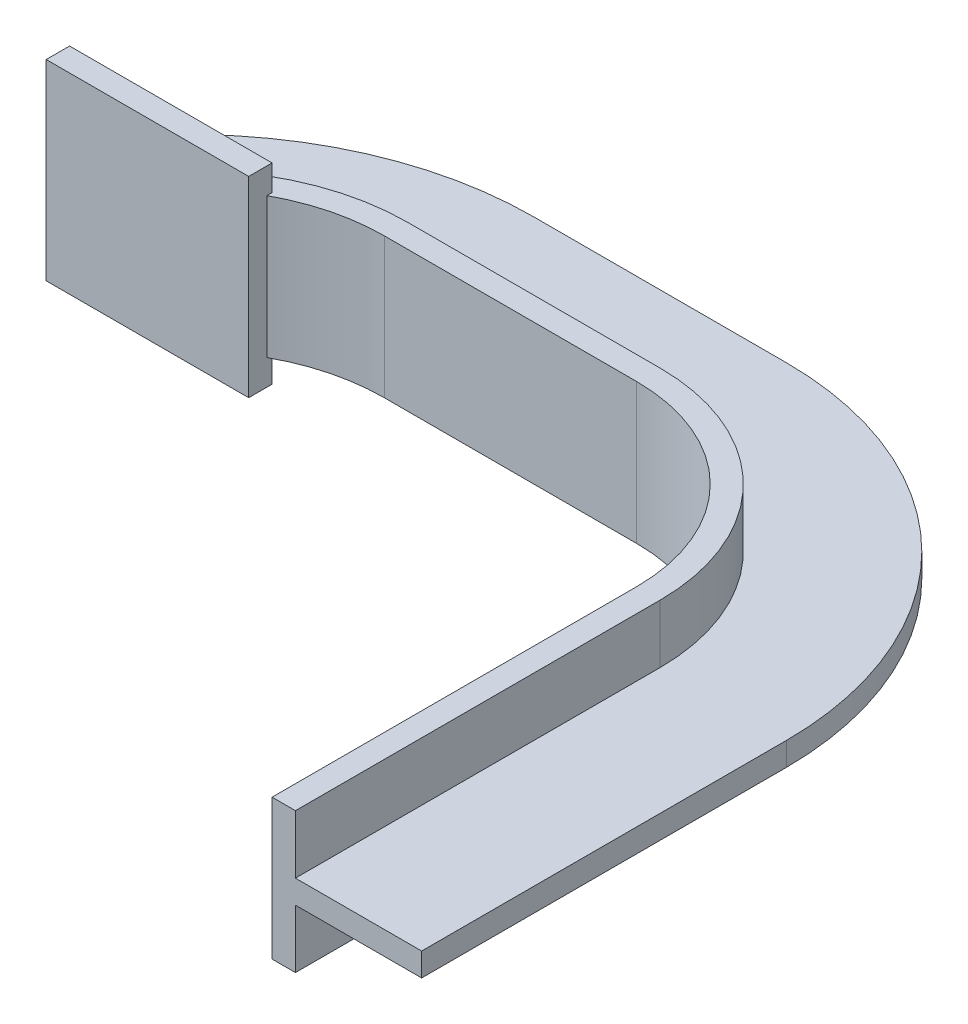
ISO-10303-21;
HEADER;
FILE_DESCRIPTION(('STEP AP214'),'2;1');
FILE_NAME('part.step','',(''),(''),'','','');
FILE_SCHEMA(('AUTOMOTIVE_DESIGN { 1 0 10303 214 1 1 1 1 }'));
ENDSEC;
DATA;
#1=APPLICATION_CONTEXT('core data for automotive mechanical design processes');
#2=APPLICATION_PROTOCOL_DEFINITION('international standard','automotive_design',2000,#1);
#3=PRODUCT_CONTEXT('',#1,'mechanical');
#4=PRODUCT('Part','Part','',(#3));
#5=PRODUCT_RELATED_PRODUCT_CATEGORY('part','',(#4));
#6=PRODUCT_DEFINITION_FORMATION('','',#4);
#7=PRODUCT_DEFINITION_CONTEXT('part definition',#1,'design');
#8=PRODUCT_DEFINITION('design','',#6,#7);
#9=PRODUCT_DEFINITION_SHAPE('','',#8);
#10=(LENGTH_UNIT() NAMED_UNIT(*) SI_UNIT(.MILLI.,.METRE.));
#11=(NAMED_UNIT(*) PLANE_ANGLE_UNIT() SI_UNIT($,.RADIAN.));
#12=(NAMED_UNIT(*) SI_UNIT($,.STERADIAN.) SOLID_ANGLE_UNIT());
#13=UNCERTAINTY_MEASURE_WITH_UNIT(LENGTH_MEASURE(1.E-05),#10,'distance_accuracy_value','');
#14=(GEOMETRIC_REPRESENTATION_CONTEXT(3) GLOBAL_UNCERTAINTY_ASSIGNED_CONTEXT((#13)) GLOBAL_UNIT_ASSIGNED_CONTEXT((#10,
#11,#12)) REPRESENTATION_CONTEXT('',''));
#15=CARTESIAN_POINT('',(0.,0.,0.));
#16=DIRECTION('',(0.,0.,1.));
#17=DIRECTION('',(1.,0.,0.));
#18=AXIS2_PLACEMENT_3D('',#15,#16,#17);
#19=CARTESIAN_POINT('',(-58.42,0.,-47.1870689655173));
#20=DIRECTION('',(0.,1.,0.));
#21=DIRECTION('',(0.,0.,1.));
#22=AXIS2_PLACEMENT_3D('',#19,#20,#21);
#23=CYLINDRICAL_SURFACE('',#22,26.4729310344827);
#24=CARTESIAN_POINT('',(-58.42,9.525,-47.1870689655173));
#25=DIRECTION('',(0.,1.,0.));
#26=DIRECTION('',(0.,0.,1.));
#27=AXIS2_PLACEMENT_3D('',#24,#25,#26);
#28=CIRCLE('',#27,26.4729310344827);
#29=CARTESIAN_POINT('',(-58.42,9.525,-73.66));
#30=VERTEX_POINT('',#29);
#31=CARTESIAN_POINT('',(-71.12,9.52500000000004,-70.4147696170341));
#32=VERTEX_POINT('',#31);
#33=EDGE_CURVE('E395',#30,#32,#28,.T.);
#34=ORIENTED_EDGE('',*,*,#33,.T.);
#35=DIRECTION('',(0.,1.,0.));
#36=VECTOR('',#35,1.);
#37=CARTESIAN_POINT('',(-71.1200000000001,0.,-70.4147696170341));
#38=LINE('',#37,#36);
#39=CARTESIAN_POINT('',(-71.12,-9.525,-70.4147696170342));
#40=VERTEX_POINT('',#39);
#41=EDGE_CURVE('E253',#32,#40,#38,.F.);
#42=ORIENTED_EDGE('',*,*,#41,.T.);
#43=CARTESIAN_POINT('',(-58.42,-9.525,-47.1870689655173));
#44=DIRECTION('',(0.,1.,0.));
#45=DIRECTION('',(0.,0.,1.));
#46=AXIS2_PLACEMENT_3D('',#43,#44,#45);
#47=CIRCLE('',#46,26.4729310344827);
#48=CARTESIAN_POINT('',(-58.42,-9.525,-73.66));
#49=VERTEX_POINT('',#48);
#50=EDGE_CURVE('E62',#49,#40,#47,.T.);
#51=ORIENTED_EDGE('',*,*,#50,.F.);
#52=DIRECTION('',(0.,-1.,0.));
#53=VECTOR('',#52,1.);
#54=CARTESIAN_POINT('',(-58.42,-9.525,-73.66));
#55=LINE('',#54,#53);
#56=EDGE_CURVE('E354',#30,#49,#55,.T.);
#57=ORIENTED_EDGE('',*,*,#56,.F.);
#58=EDGE_LOOP('',(#34,#42,#51,#57));
#59=FACE_BOUND('',#58,.T.);
#60=ADVANCED_FACE('F40',(#59),#23,.F.);
#61=CARTESIAN_POINT('',(-58.42,0.,-47.1870689655173));
#62=DIRECTION('',(0.,1.,0.));
#63=DIRECTION('',(0.,0.,1.));
#64=AXIS2_PLACEMENT_3D('',#61,#62,#63);
#65=CYLINDRICAL_SURFACE('',#64,29.6479310344827);
#66=CARTESIAN_POINT('',(-58.42,1.5875,-47.1870689655173));
#67=DIRECTION('',(0.,1.,0.));
#68=DIRECTION('',(0.,0.,1.));
#69=AXIS2_PLACEMENT_3D('',#66,#67,#68);
#70=CIRCLE('',#69,29.6479310344827);
#71=CARTESIAN_POINT('',(-58.42,1.5875,-76.835));
#72=VERTEX_POINT('',#71);
#73=CARTESIAN_POINT('',(-75.9189893057896,1.58749999999999,-71.12));
#74=VERTEX_POINT('',#73);
#75=EDGE_CURVE('E389',#72,#74,#70,.T.);
#76=ORIENTED_EDGE('',*,*,#75,.T.);
#77=DIRECTION('',(0.,1.,0.));
#78=VECTOR('',#77,1.);
#79=CARTESIAN_POINT('',(-75.9189893057896,0.,-71.12));
#80=LINE('',#79,#78);
#81=CARTESIAN_POINT('',(-75.9189893057896,9.525,-71.12));
#82=VERTEX_POINT('',#81);
#83=EDGE_CURVE('E248',#74,#82,#80,.T.);
#84=ORIENTED_EDGE('',*,*,#83,.T.);
#85=CARTESIAN_POINT('',(-58.42,9.525,-47.1870689655173));
#86=DIRECTION('',(0.,1.,0.));
#87=DIRECTION('',(0.,0.,1.));
#88=AXIS2_PLACEMENT_3D('',#85,#86,#87);
#89=CIRCLE('',#88,29.6479310344827);
#90=CARTESIAN_POINT('',(-58.42,9.525,-76.835));
#91=VERTEX_POINT('',#90);
#92=EDGE_CURVE('E392',#91,#82,#89,.T.);
#93=ORIENTED_EDGE('',*,*,#92,.F.);
#94=DIRECTION('',(0.,1.,0.));
#95=VECTOR('',#94,1.);
#96=CARTESIAN_POINT('',(-58.42,9.525,-76.835));
#97=LINE('',#96,#95);
#98=EDGE_CURVE('E351',#72,#91,#97,.T.);
#99=ORIENTED_EDGE('',*,*,#98,.F.);
#100=EDGE_LOOP('',(#76,#84,#93,#99));
#101=FACE_BOUND('',#100,.T.);
#102=ADVANCED_FACE('F495',(#101),#65,.T.);
#103=CARTESIAN_POINT('',(-58.42,0.,-47.1870689655173));
#104=DIRECTION('',(0.,1.,0.));
#105=DIRECTION('',(0.,0.,1.));
#106=AXIS2_PLACEMENT_3D('',#103,#104,#105);
#107=CYLINDRICAL_SURFACE('',#106,46.7929310344827);
#108=CARTESIAN_POINT('',(-58.42,-1.5875,-47.1870689655173));
#109=DIRECTION('',(0.,1.,0.));
#110=DIRECTION('',(0.,0.,1.));
#111=AXIS2_PLACEMENT_3D('',#108,#109,#110);
#112=CIRCLE('',#111,46.7929310344827);
#113=CARTESIAN_POINT('',(-58.42,-1.5875,-93.98));
#114=VERTEX_POINT('',#113);
#115=CARTESIAN_POINT('',(-98.6293671536441,-1.58749999999999,-71.12));
#116=VERTEX_POINT('',#115);
#117=EDGE_CURVE('E383',#114,#116,#112,.T.);
#118=ORIENTED_EDGE('',*,*,#117,.T.);
#119=DIRECTION('',(0.,1.,0.));
#120=VECTOR('',#119,1.);
#121=CARTESIAN_POINT('',(-98.6293671536441,0.,-71.12));
#122=LINE('',#121,#120);
#123=CARTESIAN_POINT('',(-98.6293671536441,1.5875,-71.12));
#124=VERTEX_POINT('',#123);
#125=EDGE_CURVE('E215',#116,#124,#122,.T.);
#126=ORIENTED_EDGE('',*,*,#125,.T.);
#127=CARTESIAN_POINT('',(-58.42,1.5875,-47.1870689655173));
#128=DIRECTION('',(0.,1.,0.));
#129=DIRECTION('',(0.,0.,1.));
#130=AXIS2_PLACEMENT_3D('',#127,#128,#129);
#131=CIRCLE('',#130,46.7929310344827);
#132=CARTESIAN_POINT('',(-58.42,1.5875,-93.98));
#133=VERTEX_POINT('',#132);
#134=EDGE_CURVE('E386',#133,#124,#131,.T.);
#135=ORIENTED_EDGE('',*,*,#134,.F.);
#136=DIRECTION('',(0.,1.,0.));
#137=VECTOR('',#136,1.);
#138=CARTESIAN_POINT('',(-58.42,1.5875,-93.98));
#139=LINE('',#138,#137);
#140=EDGE_CURVE('E348',#114,#133,#139,.T.);
#141=ORIENTED_EDGE('',*,*,#140,.F.);
#142=EDGE_LOOP('',(#118,#126,#135,#141));
#143=FACE_BOUND('',#142,.T.);
#144=ADVANCED_FACE('F467',(#143),#107,.T.);
#145=CARTESIAN_POINT('',(-58.42,0.,-47.1870689655173));
#146=DIRECTION('',(0.,1.,0.));
#147=DIRECTION('',(0.,0.,1.));
#148=AXIS2_PLACEMENT_3D('',#145,#146,#147);
#149=CYLINDRICAL_SURFACE('',#148,29.6479310344827);
#150=CARTESIAN_POINT('',(-58.42,-9.525,-47.1870689655173));
#151=DIRECTION('',(0.,1.,0.));
#152=DIRECTION('',(0.,0.,1.));
#153=AXIS2_PLACEMENT_3D('',#150,#151,#152);
#154=CIRCLE('',#153,29.6479310344827);
#155=CARTESIAN_POINT('',(-58.42,-9.525,-76.835));
#156=VERTEX_POINT('',#155);
#157=CARTESIAN_POINT('',(-75.9189893057896,-9.525,-71.12));
#158=VERTEX_POINT('',#157);
#159=EDGE_CURVE('E54',#156,#158,#154,.T.);
#160=ORIENTED_EDGE('',*,*,#159,.T.);
#161=DIRECTION('',(0.,1.,0.));
#162=VECTOR('',#161,1.);
#163=CARTESIAN_POINT('',(-75.9189893057896,0.,-71.12));
#164=LINE('',#163,#162);
#165=CARTESIAN_POINT('',(-75.9189893057896,-1.58749999999999,-71.12));
#166=VERTEX_POINT('',#165);
#167=EDGE_CURVE('E233',#158,#166,#164,.T.);
#168=ORIENTED_EDGE('',*,*,#167,.T.);
#169=CARTESIAN_POINT('',(-58.42,-1.5875,-47.1870689655173));
#170=DIRECTION('',(0.,1.,0.));
#171=DIRECTION('',(0.,0.,1.));
#172=AXIS2_PLACEMENT_3D('',#169,#170,#171);
#173=CIRCLE('',#172,29.6479310344827);
#174=CARTESIAN_POINT('',(-58.42,-1.5875,-76.835));
#175=VERTEX_POINT('',#174);
#176=EDGE_CURVE('E380',#175,#166,#173,.T.);
#177=ORIENTED_EDGE('',*,*,#176,.F.);
#178=DIRECTION('',(0.,1.,0.));
#179=VECTOR('',#178,1.);
#180=CARTESIAN_POINT('',(-58.42,-9.525,-76.835));
#181=LINE('',#180,#179);
#182=EDGE_CURVE('E345',#156,#175,#181,.T.);
#183=ORIENTED_EDGE('',*,*,#182,.F.);
#184=EDGE_LOOP('',(#160,#168,#177,#183));
#185=FACE_BOUND('',#184,.T.);
#186=ADVANCED_FACE('F401',(#185),#149,.T.);
#187=CARTESIAN_POINT('',(-24.13,-9.525,-73.66));
#188=DIRECTION('',(0.,0.,-1.));
#189=DIRECTION('',(-1.,0.,0.));
#190=AXIS2_PLACEMENT_3D('',#187,#188,#189);
#191=PLANE('',#190);
#192=DIRECTION('',(0.,-1.,0.));
#193=VECTOR('',#192,1.);
#194=CARTESIAN_POINT('',(-24.13,-9.525,-73.66));
#195=LINE('',#194,#193);
#196=CARTESIAN_POINT('',(-24.13,9.525,-73.66));
#197=VERTEX_POINT('',#196);
#198=CARTESIAN_POINT('',(-24.13,-9.525,-73.66));
#199=VERTEX_POINT('',#198);
#200=EDGE_CURVE('E318',#197,#199,#195,.T.);
#201=ORIENTED_EDGE('',*,*,#200,.F.);
#202=DIRECTION('',(-1.,0.,0.));
#203=VECTOR('',#202,1.);
#204=CARTESIAN_POINT('',(-24.13,9.525,-73.66));
#205=LINE('',#204,#203);
#206=EDGE_CURVE('E371',#197,#30,#205,.T.);
#207=ORIENTED_EDGE('',*,*,#206,.T.);
#208=ORIENTED_EDGE('',*,*,#56,.T.);
#209=DIRECTION('',(-1.,0.,0.));
#210=VECTOR('',#209,1.);
#211=CARTESIAN_POINT('',(-24.13,-9.525,-73.66));
#212=LINE('',#211,#210);
#213=EDGE_CURVE('E374',#199,#49,#212,.T.);
#214=ORIENTED_EDGE('',*,*,#213,.F.);
#215=EDGE_LOOP('',(#201,#207,#208,#214));
#216=FACE_BOUND('',#215,.T.);
#217=ADVANCED_FACE('F430',(#216),#191,.F.);
#218=CARTESIAN_POINT('',(-24.13,9.525,-76.835));
#219=DIRECTION('',(0.,0.,1.));
#220=DIRECTION('',(1.,0.,0.));
#221=AXIS2_PLACEMENT_3D('',#218,#219,#220);
#222=PLANE('',#221);
#223=DIRECTION('',(0.,1.,0.));
#224=VECTOR('',#223,1.);
#225=CARTESIAN_POINT('',(-24.13,9.525,-76.835));
#226=LINE('',#225,#224);
#227=CARTESIAN_POINT('',(-24.13,1.5875,-76.835));
#228=VERTEX_POINT('',#227);
#229=CARTESIAN_POINT('',(-24.13,9.525,-76.835));
#230=VERTEX_POINT('',#229);
#231=EDGE_CURVE('E315',#228,#230,#226,.T.);
#232=ORIENTED_EDGE('',*,*,#231,.F.);
#233=DIRECTION('',(-1.,0.,0.));
#234=VECTOR('',#233,1.);
#235=CARTESIAN_POINT('',(-24.13,1.5875,-76.835));
#236=LINE('',#235,#234);
#237=EDGE_CURVE('E365',#228,#72,#236,.T.);
#238=ORIENTED_EDGE('',*,*,#237,.T.);
#239=ORIENTED_EDGE('',*,*,#98,.T.);
#240=DIRECTION('',(-1.,0.,0.));
#241=VECTOR('',#240,1.);
#242=CARTESIAN_POINT('',(-24.13,9.525,-76.835));
#243=LINE('',#242,#241);
#244=EDGE_CURVE('E368',#230,#91,#243,.T.);
#245=ORIENTED_EDGE('',*,*,#244,.F.);
#246=EDGE_LOOP('',(#232,#238,#239,#245));
#247=FACE_BOUND('',#246,.T.);
#248=ADVANCED_FACE('F492',(#247),#222,.F.);
#249=CARTESIAN_POINT('',(-24.13,1.5875,-93.98));
#250=DIRECTION('',(0.,0.,1.));
#251=DIRECTION('',(1.,0.,0.));
#252=AXIS2_PLACEMENT_3D('',#249,#250,#251);
#253=PLANE('',#252);
#254=DIRECTION('',(0.,1.,0.));
#255=VECTOR('',#254,1.);
#256=CARTESIAN_POINT('',(-24.13,1.5875,-93.98));
#257=LINE('',#256,#255);
#258=CARTESIAN_POINT('',(-24.13,-1.5875,-93.98));
#259=VERTEX_POINT('',#258);
#260=CARTESIAN_POINT('',(-24.13,1.5875,-93.98));
#261=VERTEX_POINT('',#260);
#262=EDGE_CURVE('E312',#259,#261,#257,.T.);
#263=ORIENTED_EDGE('',*,*,#262,.F.);
#264=DIRECTION('',(-1.,0.,0.));
#265=VECTOR('',#264,1.);
#266=CARTESIAN_POINT('',(-24.13,-1.5875,-93.98));
#267=LINE('',#266,#265);
#268=EDGE_CURVE('E359',#259,#114,#267,.T.);
#269=ORIENTED_EDGE('',*,*,#268,.T.);
#270=ORIENTED_EDGE('',*,*,#140,.T.);
#271=DIRECTION('',(-1.,0.,0.));
#272=VECTOR('',#271,1.);
#273=CARTESIAN_POINT('',(-24.13,1.5875,-93.98));
#274=LINE('',#273,#272);
#275=EDGE_CURVE('E362',#261,#133,#274,.T.);
#276=ORIENTED_EDGE('',*,*,#275,.F.);
#277=EDGE_LOOP('',(#263,#269,#270,#276));
#278=FACE_BOUND('',#277,.T.);
#279=ADVANCED_FACE('F473',(#278),#253,.F.);
#280=CARTESIAN_POINT('',(-24.13,-9.525,-76.835));
#281=DIRECTION('',(0.,0.,1.));
#282=DIRECTION('',(1.,0.,0.));
#283=AXIS2_PLACEMENT_3D('',#280,#281,#282);
#284=PLANE('',#283);
#285=DIRECTION('',(0.,1.,0.));
#286=VECTOR('',#285,1.);
#287=CARTESIAN_POINT('',(-24.13,-9.525,-76.835));
#288=LINE('',#287,#286);
#289=CARTESIAN_POINT('',(-24.13,-9.525,-76.835));
#290=VERTEX_POINT('',#289);
#291=CARTESIAN_POINT('',(-24.13,-1.5875,-76.835));
#292=VERTEX_POINT('',#291);
#293=EDGE_CURVE('E296',#290,#292,#288,.T.);
#294=ORIENTED_EDGE('',*,*,#293,.F.);
#295=DIRECTION('',(-1.,0.,0.));
#296=VECTOR('',#295,1.);
#297=CARTESIAN_POINT('',(-24.13,-9.525,-76.835));
#298=LINE('',#297,#296);
#299=EDGE_CURVE('E377',#290,#156,#298,.T.);
#300=ORIENTED_EDGE('',*,*,#299,.T.);
#301=ORIENTED_EDGE('',*,*,#182,.T.);
#302=DIRECTION('',(-1.,0.,0.));
#303=VECTOR('',#302,1.);
#304=CARTESIAN_POINT('',(-24.13,-1.5875,-76.835));
#305=LINE('',#304,#303);
#306=EDGE_CURVE('E356',#292,#175,#305,.T.);
#307=ORIENTED_EDGE('',*,*,#306,.F.);
#308=EDGE_LOOP('',(#294,#300,#301,#307));
#309=FACE_BOUND('',#308,.T.);
#310=ADVANCED_FACE('F406',(#309),#284,.F.);
#311=CARTESIAN_POINT('',(-24.13,0.,-49.53));
#312=DIRECTION('',(0.,1.,0.));
#313=DIRECTION('',(0.,0.,1.));
#314=AXIS2_PLACEMENT_3D('',#311,#312,#313);
#315=CYLINDRICAL_SURFACE('',#314,24.13);
#316=DIRECTION('',(0.,-1.,0.));
#317=VECTOR('',#316,1.);
#318=CARTESIAN_POINT('',(0.,-9.525,-49.53));
#319=LINE('',#318,#317);
#320=CARTESIAN_POINT('',(0.,9.525,-49.53));
#321=VERTEX_POINT('',#320);
#322=CARTESIAN_POINT('',(0.,-9.525,-49.53));
#323=VERTEX_POINT('',#322);
#324=EDGE_CURVE('E290',#321,#323,#319,.T.);
#325=ORIENTED_EDGE('',*,*,#324,.F.);
#326=CARTESIAN_POINT('',(-24.13,9.525,-49.53));
#327=DIRECTION('',(0.,1.,0.));
#328=DIRECTION('',(0.,0.,1.));
#329=AXIS2_PLACEMENT_3D('',#326,#327,#328);
#330=CIRCLE('',#329,24.13);
#331=EDGE_CURVE('E336',#321,#197,#330,.T.);
#332=ORIENTED_EDGE('',*,*,#331,.T.);
#333=ORIENTED_EDGE('',*,*,#200,.T.);
#334=CARTESIAN_POINT('',(-24.13,-9.525,-49.53));
#335=DIRECTION('',(0.,1.,0.));
#336=DIRECTION('',(0.,0.,1.));
#337=AXIS2_PLACEMENT_3D('',#334,#335,#336);
#338=CIRCLE('',#337,24.13);
#339=EDGE_CURVE('E339',#323,#199,#338,.T.);
#340=ORIENTED_EDGE('',*,*,#339,.F.);
#341=EDGE_LOOP('',(#325,#332,#333,#340));
#342=FACE_BOUND('',#341,.T.);
#343=ADVANCED_FACE('F427',(#342),#315,.F.);
#344=CARTESIAN_POINT('',(-24.13,0.,-49.53));
#345=DIRECTION('',(0.,1.,0.));
#346=DIRECTION('',(0.,0.,1.));
#347=AXIS2_PLACEMENT_3D('',#344,#345,#346);
#348=CYLINDRICAL_SURFACE('',#347,27.305);
#349=DIRECTION('',(0.,1.,0.));
#350=VECTOR('',#349,1.);
#351=CARTESIAN_POINT('',(3.175,9.525,-49.53));
#352=LINE('',#351,#350);
#353=CARTESIAN_POINT('',(3.17500000000001,1.5875,-49.53));
#354=VERTEX_POINT('',#353);
#355=CARTESIAN_POINT('',(3.175,9.525,-49.53));
#356=VERTEX_POINT('',#355);
#357=EDGE_CURVE('E287',#354,#356,#352,.T.);
#358=ORIENTED_EDGE('',*,*,#357,.F.);
#359=CARTESIAN_POINT('',(-24.13,1.5875,-49.53));
#360=DIRECTION('',(0.,1.,0.));
#361=DIRECTION('',(0.,0.,1.));
#362=AXIS2_PLACEMENT_3D('',#359,#360,#361);
#363=CIRCLE('',#362,27.305);
#364=EDGE_CURVE('E330',#354,#228,#363,.T.);
#365=ORIENTED_EDGE('',*,*,#364,.T.);
#366=ORIENTED_EDGE('',*,*,#231,.T.);
#367=CARTESIAN_POINT('',(-24.13,9.525,-49.53));
#368=DIRECTION('',(0.,1.,0.));
#369=DIRECTION('',(0.,0.,1.));
#370=AXIS2_PLACEMENT_3D('',#367,#368,#369);
#371=CIRCLE('',#370,27.305);
#372=EDGE_CURVE('E333',#356,#230,#371,.T.);
#373=ORIENTED_EDGE('',*,*,#372,.F.);
#374=EDGE_LOOP('',(#358,#365,#366,#373));
#375=FACE_BOUND('',#374,.T.);
#376=ADVANCED_FACE('F489',(#375),#348,.T.);
#377=CARTESIAN_POINT('',(-24.13,0.,-49.53));
#378=DIRECTION('',(0.,1.,0.));
#379=DIRECTION('',(0.,0.,1.));
#380=AXIS2_PLACEMENT_3D('',#377,#378,#379);
#381=CYLINDRICAL_SURFACE('',#380,44.45);
#382=DIRECTION('',(0.,1.,0.));
#383=VECTOR('',#382,1.);
#384=CARTESIAN_POINT('',(20.32,1.5875,-49.53));
#385=LINE('',#384,#383);
#386=CARTESIAN_POINT('',(20.32,-1.5875,-49.53));
#387=VERTEX_POINT('',#386);
#388=CARTESIAN_POINT('',(20.32,1.5875,-49.53));
#389=VERTEX_POINT('',#388);
#390=EDGE_CURVE('E284',#387,#389,#385,.T.);
#391=ORIENTED_EDGE('',*,*,#390,.F.);
#392=CARTESIAN_POINT('',(-24.13,-1.5875,-49.53));
#393=DIRECTION('',(0.,1.,0.));
#394=DIRECTION('',(0.,0.,1.));
#395=AXIS2_PLACEMENT_3D('',#392,#393,#394);
#396=CIRCLE('',#395,44.45);
#397=EDGE_CURVE('E324',#387,#259,#396,.T.);
#398=ORIENTED_EDGE('',*,*,#397,.T.);
#399=ORIENTED_EDGE('',*,*,#262,.T.);
#400=CARTESIAN_POINT('',(-24.13,1.5875,-49.53));
#401=DIRECTION('',(0.,1.,0.));
#402=DIRECTION('',(0.,0.,1.));
#403=AXIS2_PLACEMENT_3D('',#400,#401,#402);
#404=CIRCLE('',#403,44.45);
#405=EDGE_CURVE('E327',#389,#261,#404,.T.);
#406=ORIENTED_EDGE('',*,*,#405,.F.);
#407=EDGE_LOOP('',(#391,#398,#399,#406));
#408=FACE_BOUND('',#407,.T.);
#409=ADVANCED_FACE('F476',(#408),#381,.T.);
#410=CARTESIAN_POINT('',(-24.13,0.,-49.53));
#411=DIRECTION('',(0.,1.,0.));
#412=DIRECTION('',(0.,0.,1.));
#413=AXIS2_PLACEMENT_3D('',#410,#411,#412);
#414=CYLINDRICAL_SURFACE('',#413,27.305);
#415=DIRECTION('',(0.,1.,0.));
#416=VECTOR('',#415,1.);
#417=CARTESIAN_POINT('',(3.175,-9.525,-49.53));
#418=LINE('',#417,#416);
#419=CARTESIAN_POINT('',(3.175,-9.525,-49.53));
#420=VERTEX_POINT('',#419);
#421=CARTESIAN_POINT('',(3.17500000000001,-1.5875,-49.53));
#422=VERTEX_POINT('',#421);
#423=EDGE_CURVE('E281',#420,#422,#418,.T.);
#424=ORIENTED_EDGE('',*,*,#423,.F.);
#425=CARTESIAN_POINT('',(-24.13,-9.525,-49.53));
#426=DIRECTION('',(0.,1.,0.));
#427=DIRECTION('',(0.,0.,1.));
#428=AXIS2_PLACEMENT_3D('',#425,#426,#427);
#429=CIRCLE('',#428,27.305);
#430=EDGE_CURVE('E342',#420,#290,#429,.T.);
#431=ORIENTED_EDGE('',*,*,#430,.T.);
#432=ORIENTED_EDGE('',*,*,#293,.T.);
#433=CARTESIAN_POINT('',(-24.13,-1.5875,-49.53));
#434=DIRECTION('',(0.,1.,0.));
#435=DIRECTION('',(0.,0.,1.));
#436=AXIS2_PLACEMENT_3D('',#433,#434,#435);
#437=CIRCLE('',#436,27.305);
#438=EDGE_CURVE('E321',#422,#292,#437,.T.);
#439=ORIENTED_EDGE('',*,*,#438,.F.);
#440=EDGE_LOOP('',(#424,#431,#432,#439));
#441=FACE_BOUND('',#440,.T.);
#442=ADVANCED_FACE('F409',(#441),#414,.T.);
#443=CARTESIAN_POINT('',(3.175,-9.525,-49.53));
#444=DIRECTION('',(1.,0.,0.));
#445=DIRECTION('',(0.,1.,0.));
#446=AXIS2_PLACEMENT_3D('',#443,#444,#445);
#447=PLANE('',#446);
#448=DIRECTION('',(0.,1.,0.));
#449=VECTOR('',#448,1.);
#450=CARTESIAN_POINT('',(3.175,-9.525,0.));
#451=LINE('',#450,#449);
#452=CARTESIAN_POINT('',(3.175,-9.525,0.));
#453=VERTEX_POINT('',#452);
#454=CARTESIAN_POINT('',(3.175,-1.5875,0.));
#455=VERTEX_POINT('',#454);
#456=EDGE_CURVE('E257',#453,#455,#451,.T.);
#457=ORIENTED_EDGE('',*,*,#456,.F.);
#458=DIRECTION('',(0.,0.,1.));
#459=VECTOR('',#458,1.);
#460=CARTESIAN_POINT('',(3.175,-9.525,-49.53));
#461=LINE('',#460,#459);
#462=EDGE_CURVE('E294',#420,#453,#461,.T.);
#463=ORIENTED_EDGE('',*,*,#462,.F.);
#464=ORIENTED_EDGE('',*,*,#423,.T.);
#465=DIRECTION('',(0.,0.,1.));
#466=VECTOR('',#465,1.);
#467=CARTESIAN_POINT('',(3.17500000000001,-1.5875,-49.53));
#468=LINE('',#467,#466);
#469=EDGE_CURVE('E293',#422,#455,#468,.T.);
#470=ORIENTED_EDGE('',*,*,#469,.T.);
#471=EDGE_LOOP('',(#457,#463,#464,#470));
#472=FACE_BOUND('',#471,.T.);
#473=ADVANCED_FACE('F416',(#472),#447,.T.);
#474=CARTESIAN_POINT('',(0.,-9.525,-49.53));
#475=DIRECTION('',(0.,-1.,0.));
#476=DIRECTION('',(1.,0.,0.));
#477=AXIS2_PLACEMENT_3D('',#474,#475,#476);
#478=PLANE('',#477);
#479=DIRECTION('',(1.,0.,0.));
#480=VECTOR('',#479,1.);
#481=CARTESIAN_POINT('',(0.,-9.525,-71.12));
#482=LINE('',#481,#480);
#483=CARTESIAN_POINT('',(-71.12,-9.52500000000003,-71.12));
#484=VERTEX_POINT('',#483);
#485=EDGE_CURVE('E246',#158,#484,#482,.T.);
#486=ORIENTED_EDGE('',*,*,#485,.F.);
#487=ORIENTED_EDGE('',*,*,#159,.F.);
#488=ORIENTED_EDGE('',*,*,#299,.F.);
#489=ORIENTED_EDGE('',*,*,#430,.F.);
#490=ORIENTED_EDGE('',*,*,#462,.T.);
#491=DIRECTION('',(1.,0.,0.));
#492=VECTOR('',#491,1.);
#493=CARTESIAN_POINT('',(0.,-9.525,0.));
#494=LINE('',#493,#492);
#495=CARTESIAN_POINT('',(0.,-9.525,0.));
#496=VERTEX_POINT('',#495);
#497=EDGE_CURVE('E278',#496,#453,#494,.T.);
#498=ORIENTED_EDGE('',*,*,#497,.F.);
#499=DIRECTION('',(0.,0.,1.));
#500=VECTOR('',#499,1.);
#501=CARTESIAN_POINT('',(0.,-9.525,-49.53));
#502=LINE('',#501,#500);
#503=EDGE_CURVE('E297',#323,#496,#502,.T.);
#504=ORIENTED_EDGE('',*,*,#503,.F.);
#505=ORIENTED_EDGE('',*,*,#339,.T.);
#506=ORIENTED_EDGE('',*,*,#213,.T.);
#507=ORIENTED_EDGE('',*,*,#50,.T.);
#508=DIRECTION('',(0.,0.,1.));
#509=VECTOR('',#508,1.);
#510=CARTESIAN_POINT('',(-71.1200000000001,-9.52500000000004,-49.53));
#511=LINE('',#510,#509);
#512=EDGE_CURVE('E255',#484,#40,#511,.T.);
#513=ORIENTED_EDGE('',*,*,#512,.F.);
#514=EDGE_LOOP('',(#486,#487,#488,#489,#490,#498,#504,#505,#506,#507,#513));
#515=FACE_BOUND('',#514,.T.);
#516=ADVANCED_FACE('F411',(#515),#478,.T.);
#517=CARTESIAN_POINT('',(0.,-9.525,-49.53));
#518=DIRECTION('',(-1.,0.,0.));
#519=DIRECTION('',(0.,0.,1.));
#520=AXIS2_PLACEMENT_3D('',#517,#518,#519);
#521=PLANE('',#520);
#522=DIRECTION('',(0.,-1.,0.));
#523=VECTOR('',#522,1.);
#524=CARTESIAN_POINT('',(0.,-9.525,0.));
#525=LINE('',#524,#523);
#526=CARTESIAN_POINT('',(0.,9.525,0.));
#527=VERTEX_POINT('',#526);
#528=EDGE_CURVE('E275',#527,#496,#525,.T.);
#529=ORIENTED_EDGE('',*,*,#528,.F.);
#530=DIRECTION('',(0.,0.,1.));
#531=VECTOR('',#530,1.);
#532=CARTESIAN_POINT('',(0.,9.525,-49.53));
#533=LINE('',#532,#531);
#534=EDGE_CURVE('E299',#321,#527,#533,.T.);
#535=ORIENTED_EDGE('',*,*,#534,.F.);
#536=ORIENTED_EDGE('',*,*,#324,.T.);
#537=ORIENTED_EDGE('',*,*,#503,.T.);
#538=EDGE_LOOP('',(#529,#535,#536,#537));
#539=FACE_BOUND('',#538,.T.);
#540=ADVANCED_FACE('F424',(#539),#521,.T.);
#541=CARTESIAN_POINT('',(0.,9.525,-49.53));
#542=DIRECTION('',(0.,1.,0.));
#543=DIRECTION('',(-1.,0.,0.));
#544=AXIS2_PLACEMENT_3D('',#541,#542,#543);
#545=PLANE('',#544);
#546=DIRECTION('',(-1.,0.,0.));
#547=VECTOR('',#546,1.);
#548=CARTESIAN_POINT('',(0.,9.525,-71.12));
#549=LINE('',#548,#547);
#550=CARTESIAN_POINT('',(-71.12,9.52500000000004,-71.12));
#551=VERTEX_POINT('',#550);
#552=EDGE_CURVE('E251',#551,#82,#549,.T.);
#553=ORIENTED_EDGE('',*,*,#552,.F.);
#554=DIRECTION('',(0.,0.,-1.));
#555=VECTOR('',#554,1.);
#556=CARTESIAN_POINT('',(-71.1200000000001,9.52500000000004,-49.53));
#557=LINE('',#556,#555);
#558=EDGE_CURVE('E11',#32,#551,#557,.T.);
#559=ORIENTED_EDGE('',*,*,#558,.F.);
#560=ORIENTED_EDGE('',*,*,#33,.F.);
#561=ORIENTED_EDGE('',*,*,#206,.F.);
#562=ORIENTED_EDGE('',*,*,#331,.F.);
#563=ORIENTED_EDGE('',*,*,#534,.T.);
#564=DIRECTION('',(-1.,0.,0.));
#565=VECTOR('',#564,1.);
#566=CARTESIAN_POINT('',(0.,9.525,0.));
#567=LINE('',#566,#565);
#568=CARTESIAN_POINT('',(3.175,9.525,0.));
#569=VERTEX_POINT('',#568);
#570=EDGE_CURVE('E272',#569,#527,#567,.T.);
#571=ORIENTED_EDGE('',*,*,#570,.F.);
#572=DIRECTION('',(0.,0.,1.));
#573=VECTOR('',#572,1.);
#574=CARTESIAN_POINT('',(3.175,9.525,-49.53));
#575=LINE('',#574,#573);
#576=EDGE_CURVE('E301',#356,#569,#575,.T.);
#577=ORIENTED_EDGE('',*,*,#576,.F.);
#578=ORIENTED_EDGE('',*,*,#372,.T.);
#579=ORIENTED_EDGE('',*,*,#244,.T.);
#580=ORIENTED_EDGE('',*,*,#92,.T.);
#581=EDGE_LOOP('',(#553,#559,#560,#561,#562,#563,#571,#577,#578,#579,#580));
#582=FACE_BOUND('',#581,.T.);
#583=ADVANCED_FACE('F434',(#582),#545,.T.);
#584=CARTESIAN_POINT('',(3.175,9.525,-49.53));
#585=DIRECTION('',(1.,0.,0.));
#586=DIRECTION('',(0.,1.,0.));
#587=AXIS2_PLACEMENT_3D('',#584,#585,#586);
#588=PLANE('',#587);
#589=DIRECTION('',(0.,1.,0.));
#590=VECTOR('',#589,1.);
#591=CARTESIAN_POINT('',(3.175,9.525,0.));
#592=LINE('',#591,#590);
#593=CARTESIAN_POINT('',(3.175,1.5875,0.));
#594=VERTEX_POINT('',#593);
#595=EDGE_CURVE('E269',#594,#569,#592,.T.);
#596=ORIENTED_EDGE('',*,*,#595,.F.);
#597=DIRECTION('',(0.,0.,1.));
#598=VECTOR('',#597,1.);
#599=CARTESIAN_POINT('',(3.17500000000001,1.5875,-49.53));
#600=LINE('',#599,#598);
#601=EDGE_CURVE('E303',#354,#594,#600,.T.);
#602=ORIENTED_EDGE('',*,*,#601,.F.);
#603=ORIENTED_EDGE('',*,*,#357,.T.);
#604=ORIENTED_EDGE('',*,*,#576,.T.);
#605=EDGE_LOOP('',(#596,#602,#603,#604));
#606=FACE_BOUND('',#605,.T.);
#607=ADVANCED_FACE('F486',(#606),#588,.T.);
#608=CARTESIAN_POINT('',(3.17500000000001,1.5875,-49.53));
#609=DIRECTION('',(0.,1.,0.));
#610=DIRECTION('',(-1.,0.,0.));
#611=AXIS2_PLACEMENT_3D('',#608,#609,#610);
#612=PLANE('',#611);
#613=DIRECTION('',(-1.,0.,0.));
#614=VECTOR('',#613,1.);
#615=CARTESIAN_POINT('',(3.175,1.5875,-71.12));
#616=LINE('',#615,#614);
#617=EDGE_CURVE('E243',#74,#124,#616,.T.);
#618=ORIENTED_EDGE('',*,*,#617,.F.);
#619=ORIENTED_EDGE('',*,*,#75,.F.);
#620=ORIENTED_EDGE('',*,*,#237,.F.);
#621=ORIENTED_EDGE('',*,*,#364,.F.);
#622=ORIENTED_EDGE('',*,*,#601,.T.);
#623=DIRECTION('',(-1.,0.,0.));
#624=VECTOR('',#623,1.);
#625=CARTESIAN_POINT('',(3.175,1.5875,0.));
#626=LINE('',#625,#624);
#627=CARTESIAN_POINT('',(20.32,1.5875,0.));
#628=VERTEX_POINT('',#627);
#629=EDGE_CURVE('E266',#628,#594,#626,.T.);
#630=ORIENTED_EDGE('',*,*,#629,.F.);
#631=DIRECTION('',(0.,0.,1.));
#632=VECTOR('',#631,1.);
#633=CARTESIAN_POINT('',(20.32,1.5875,-49.53));
#634=LINE('',#633,#632);
#635=EDGE_CURVE('E305',#389,#628,#634,.T.);
#636=ORIENTED_EDGE('',*,*,#635,.F.);
#637=ORIENTED_EDGE('',*,*,#405,.T.);
#638=ORIENTED_EDGE('',*,*,#275,.T.);
#639=ORIENTED_EDGE('',*,*,#134,.T.);
#640=EDGE_LOOP('',(#618,#619,#620,#621,#622,#630,#636,#637,#638,#639));
#641=FACE_BOUND('',#640,.T.);
#642=ADVANCED_FACE('F469',(#641),#612,.T.);
#643=CARTESIAN_POINT('',(20.32,1.5875,-49.53));
#644=DIRECTION('',(1.,0.,0.));
#645=DIRECTION('',(0.,0.,-1.));
#646=AXIS2_PLACEMENT_3D('',#643,#644,#645);
#647=PLANE('',#646);
#648=DIRECTION('',(0.,1.,0.));
#649=VECTOR('',#648,1.);
#650=CARTESIAN_POINT('',(20.32,1.5875,0.));
#651=LINE('',#650,#649);
#652=CARTESIAN_POINT('',(20.32,-1.5875,0.));
#653=VERTEX_POINT('',#652);
#654=EDGE_CURVE('E263',#653,#628,#651,.T.);
#655=ORIENTED_EDGE('',*,*,#654,.F.);
#656=DIRECTION('',(0.,0.,1.));
#657=VECTOR('',#656,1.);
#658=CARTESIAN_POINT('',(20.32,-1.5875,-49.53));
#659=LINE('',#658,#657);
#660=EDGE_CURVE('E307',#387,#653,#659,.T.);
#661=ORIENTED_EDGE('',*,*,#660,.F.);
#662=ORIENTED_EDGE('',*,*,#390,.T.);
#663=ORIENTED_EDGE('',*,*,#635,.T.);
#664=EDGE_LOOP('',(#655,#661,#662,#663));
#665=FACE_BOUND('',#664,.T.);
#666=ADVANCED_FACE('F480',(#665),#647,.T.);
#667=CARTESIAN_POINT('',(3.17500000000001,-1.5875,-49.53));
#668=DIRECTION('',(0.,-1.,0.));
#669=DIRECTION('',(1.,0.,0.));
#670=AXIS2_PLACEMENT_3D('',#667,#668,#669);
#671=PLANE('',#670);
#672=DIRECTION('',(1.,0.,0.));
#673=VECTOR('',#672,1.);
#674=CARTESIAN_POINT('',(3.175,-1.5875,-71.12));
#675=LINE('',#674,#673);
#676=EDGE_CURVE('E47',#116,#166,#675,.T.);
#677=ORIENTED_EDGE('',*,*,#676,.F.);
#678=ORIENTED_EDGE('',*,*,#117,.F.);
#679=ORIENTED_EDGE('',*,*,#268,.F.);
#680=ORIENTED_EDGE('',*,*,#397,.F.);
#681=ORIENTED_EDGE('',*,*,#660,.T.);
#682=DIRECTION('',(1.,0.,0.));
#683=VECTOR('',#682,1.);
#684=CARTESIAN_POINT('',(3.175,-1.5875,0.));
#685=LINE('',#684,#683);
#686=EDGE_CURVE('E260',#455,#653,#685,.T.);
#687=ORIENTED_EDGE('',*,*,#686,.F.);
#688=ORIENTED_EDGE('',*,*,#469,.F.);
#689=ORIENTED_EDGE('',*,*,#438,.T.);
#690=ORIENTED_EDGE('',*,*,#306,.T.);
#691=ORIENTED_EDGE('',*,*,#176,.T.);
#692=EDGE_LOOP('',(#677,#678,#679,#680,#681,#687,#688,#689,#690,#691));
#693=FACE_BOUND('',#692,.T.);
#694=ADVANCED_FACE('F402',(#693),#671,.T.);
#695=CARTESIAN_POINT('',(3.175,-1.5875,0.));
#696=DIRECTION('',(0.,0.,-1.));
#697=DIRECTION('',(-1.,0.,0.));
#698=AXIS2_PLACEMENT_3D('',#695,#696,#697);
#699=PLANE('',#698);
#700=ORIENTED_EDGE('',*,*,#456,.T.);
#701=ORIENTED_EDGE('',*,*,#686,.T.);
#702=ORIENTED_EDGE('',*,*,#654,.T.);
#703=ORIENTED_EDGE('',*,*,#629,.T.);
#704=ORIENTED_EDGE('',*,*,#595,.T.);
#705=ORIENTED_EDGE('',*,*,#570,.T.);
#706=ORIENTED_EDGE('',*,*,#528,.T.);
#707=ORIENTED_EDGE('',*,*,#497,.T.);
#708=EDGE_LOOP('',(#700,#701,#702,#703,#704,#705,#706,#707));
#709=FACE_BOUND('',#708,.T.);
#710=ADVANCED_FACE('F419',(#709),#699,.F.);
#711=CARTESIAN_POINT('',(-98.6293671536441,-13.0175,-71.12));
#712=DIRECTION('',(0.,0.,-1.));
#713=DIRECTION('',(-1.,0.,0.));
#714=AXIS2_PLACEMENT_3D('',#711,#712,#713);
#715=PLANE('',#714);
#716=DIRECTION('',(0.,1.,0.));
#717=VECTOR('',#716,1.);
#718=CARTESIAN_POINT('',(-71.12,-13.0175,-71.12));
#719=LINE('',#718,#717);
#720=CARTESIAN_POINT('',(-71.12,13.0175,-71.12));
#721=VERTEX_POINT('',#720);
#722=EDGE_CURVE('E228',#551,#721,#719,.T.);
#723=ORIENTED_EDGE('',*,*,#722,.F.);
#724=ORIENTED_EDGE('',*,*,#552,.T.);
#725=ORIENTED_EDGE('',*,*,#83,.F.);
#726=ORIENTED_EDGE('',*,*,#617,.T.);
#727=DIRECTION('',(0.,-1.,0.));
#728=VECTOR('',#727,1.);
#729=CARTESIAN_POINT('',(-98.6293671536441,-13.0175,-71.12));
#730=LINE('',#729,#728);
#731=CARTESIAN_POINT('',(-98.6293671536441,13.0175,-71.12));
#732=VERTEX_POINT('',#731);
#733=EDGE_CURVE('E218',#732,#124,#730,.T.);
#734=ORIENTED_EDGE('',*,*,#733,.F.);
#735=DIRECTION('',(-1.,0.,0.));
#736=VECTOR('',#735,1.);
#737=CARTESIAN_POINT('',(-98.6293671536441,13.0175,-71.12));
#738=LINE('',#737,#736);
#739=EDGE_CURVE('E444',#721,#732,#738,.T.);
#740=ORIENTED_EDGE('',*,*,#739,.F.);
#741=EDGE_LOOP('',(#723,#724,#725,#726,#734,#740));
#742=FACE_BOUND('',#741,.T.);
#743=ADVANCED_FACE('F442',(#742),#715,.T.);
#744=CARTESIAN_POINT('',(-98.6293671536441,-13.0175,-67.945));
#745=DIRECTION('',(1.,0.,0.));
#746=DIRECTION('',(0.,0.,-1.));
#747=AXIS2_PLACEMENT_3D('',#744,#745,#746);
#748=PLANE('',#747);
#749=ORIENTED_EDGE('',*,*,#733,.T.);
#750=ORIENTED_EDGE('',*,*,#125,.F.);
#751=CARTESIAN_POINT('',(-98.6293671536441,-13.0175,-71.12));
#752=VERTEX_POINT('',#751);
#753=EDGE_CURVE('E208',#116,#752,#730,.T.);
#754=ORIENTED_EDGE('',*,*,#753,.T.);
#755=DIRECTION('',(0.,0.,-1.));
#756=VECTOR('',#755,1.);
#757=CARTESIAN_POINT('',(-98.6293671536441,-13.0175,-67.945));
#758=LINE('',#757,#756);
#759=CARTESIAN_POINT('',(-98.6293671536441,-13.0175,-67.945));
#760=VERTEX_POINT('',#759);
#761=EDGE_CURVE('E213',#760,#752,#758,.T.);
#762=ORIENTED_EDGE('',*,*,#761,.F.);
#763=DIRECTION('',(0.,-1.,0.));
#764=VECTOR('',#763,1.);
#765=CARTESIAN_POINT('',(-98.6293671536441,-13.0175,-67.945));
#766=LINE('',#765,#764);
#767=CARTESIAN_POINT('',(-98.6293671536441,13.0175,-67.945));
#768=VERTEX_POINT('',#767);
#769=EDGE_CURVE('E448',#768,#760,#766,.T.);
#770=ORIENTED_EDGE('',*,*,#769,.F.);
#771=DIRECTION('',(0.,0.,-1.));
#772=VECTOR('',#771,1.);
#773=CARTESIAN_POINT('',(-98.6293671536441,13.0175,-67.945));
#774=LINE('',#773,#772);
#775=EDGE_CURVE('E455',#768,#732,#774,.T.);
#776=ORIENTED_EDGE('',*,*,#775,.T.);
#777=EDGE_LOOP('',(#749,#750,#754,#762,#770,#776));
#778=FACE_BOUND('',#777,.T.);
#779=ADVANCED_FACE('F210',(#778),#748,.F.);
#780=CARTESIAN_POINT('',(-98.6293671536441,-13.0175,-67.945));
#781=DIRECTION('',(0.,1.,0.));
#782=DIRECTION('',(0.,0.,1.));
#783=AXIS2_PLACEMENT_3D('',#780,#781,#782);
#784=PLANE('',#783);
#785=DIRECTION('',(1.,0.,0.));
#786=VECTOR('',#785,1.);
#787=CARTESIAN_POINT('',(-98.6293671536441,-13.0175,-71.12));
#788=LINE('',#787,#786);
#789=CARTESIAN_POINT('',(-71.12,-13.0175,-71.12));
#790=VERTEX_POINT('',#789);
#791=EDGE_CURVE('E221',#752,#790,#788,.T.);
#792=ORIENTED_EDGE('',*,*,#791,.T.);
#793=DIRECTION('',(0.,0.,-1.));
#794=VECTOR('',#793,1.);
#795=CARTESIAN_POINT('',(-71.12,-13.0175,-67.945));
#796=LINE('',#795,#794);
#797=CARTESIAN_POINT('',(-71.12,-13.0175,-67.945));
#798=VERTEX_POINT('',#797);
#799=EDGE_CURVE('E234',#798,#790,#796,.T.);
#800=ORIENTED_EDGE('',*,*,#799,.F.);
#801=DIRECTION('',(1.,0.,0.));
#802=VECTOR('',#801,1.);
#803=CARTESIAN_POINT('',(-98.6293671536441,-13.0175,-67.945));
#804=LINE('',#803,#802);
#805=EDGE_CURVE('E231',#760,#798,#804,.T.);
#806=ORIENTED_EDGE('',*,*,#805,.F.);
#807=ORIENTED_EDGE('',*,*,#761,.T.);
#808=EDGE_LOOP('',(#792,#800,#806,#807));
#809=FACE_BOUND('',#808,.T.);
#810=ADVANCED_FACE('F230',(#809),#784,.F.);
#811=CARTESIAN_POINT('',(-71.12,-13.0175,-67.945));
#812=DIRECTION('',(-1.,0.,0.));
#813=DIRECTION('',(0.,0.,1.));
#814=AXIS2_PLACEMENT_3D('',#811,#812,#813);
#815=PLANE('',#814);
#816=ORIENTED_EDGE('',*,*,#512,.T.);
#817=ORIENTED_EDGE('',*,*,#41,.F.);
#818=ORIENTED_EDGE('',*,*,#558,.T.);
#819=ORIENTED_EDGE('',*,*,#722,.T.);
#820=DIRECTION('',(0.,0.,-1.));
#821=VECTOR('',#820,1.);
#822=CARTESIAN_POINT('',(-71.12,13.0175,-67.945));
#823=LINE('',#822,#821);
#824=CARTESIAN_POINT('',(-71.12,13.0175,-67.945));
#825=VERTEX_POINT('',#824);
#826=EDGE_CURVE('E238',#825,#721,#823,.T.);
#827=ORIENTED_EDGE('',*,*,#826,.F.);
#828=DIRECTION('',(0.,1.,0.));
#829=VECTOR('',#828,1.);
#830=CARTESIAN_POINT('',(-71.12,-13.0175,-67.945));
#831=LINE('',#830,#829);
#832=EDGE_CURVE('E451',#798,#825,#831,.T.);
#833=ORIENTED_EDGE('',*,*,#832,.F.);
#834=ORIENTED_EDGE('',*,*,#799,.T.);
#835=EDGE_CURVE('E224',#790,#484,#719,.T.);
#836=ORIENTED_EDGE('',*,*,#835,.T.);
#837=EDGE_LOOP('',(#816,#817,#818,#819,#827,#833,#834,#836));
#838=FACE_BOUND('',#837,.T.);
#839=ADVANCED_FACE('F437',(#838),#815,.F.);
#840=CARTESIAN_POINT('',(-98.6293671536441,13.0175,-67.945));
#841=DIRECTION('',(0.,-1.,0.));
#842=DIRECTION('',(1.,0.,0.));
#843=AXIS2_PLACEMENT_3D('',#840,#841,#842);
#844=PLANE('',#843);
#845=ORIENTED_EDGE('',*,*,#739,.T.);
#846=ORIENTED_EDGE('',*,*,#775,.F.);
#847=DIRECTION('',(-1.,0.,0.));
#848=VECTOR('',#847,1.);
#849=CARTESIAN_POINT('',(-98.6293671536441,13.0175,-67.945));
#850=LINE('',#849,#848);
#851=EDGE_CURVE('E453',#825,#768,#850,.T.);
#852=ORIENTED_EDGE('',*,*,#851,.F.);
#853=ORIENTED_EDGE('',*,*,#826,.T.);
#854=EDGE_LOOP('',(#845,#846,#852,#853));
#855=FACE_BOUND('',#854,.T.);
#856=ADVANCED_FACE('F459',(#855),#844,.F.);
#857=CARTESIAN_POINT('',(-98.6293671536441,-13.0175,-67.945));
#858=DIRECTION('',(0.,0.,-1.));
#859=DIRECTION('',(-1.,0.,0.));
#860=AXIS2_PLACEMENT_3D('',#857,#858,#859);
#861=PLANE('',#860);
#862=ORIENTED_EDGE('',*,*,#769,.T.);
#863=ORIENTED_EDGE('',*,*,#805,.T.);
#864=ORIENTED_EDGE('',*,*,#832,.T.);
#865=ORIENTED_EDGE('',*,*,#851,.T.);
#866=EDGE_LOOP('',(#862,#863,#864,#865));
#867=FACE_BOUND('',#866,.T.);
#868=ADVANCED_FACE('F463',(#867),#861,.F.);
#869=ORIENTED_EDGE('',*,*,#167,.F.);
#870=ORIENTED_EDGE('',*,*,#485,.T.);
#871=ORIENTED_EDGE('',*,*,#835,.F.);
#872=ORIENTED_EDGE('',*,*,#791,.F.);
#873=ORIENTED_EDGE('',*,*,#753,.F.);
#874=ORIENTED_EDGE('',*,*,#676,.T.);
#875=EDGE_LOOP('',(#869,#870,#871,#872,#873,#874));
#876=FACE_BOUND('',#875,.T.);
#877=ADVANCED_FACE('F222',(#876),#715,.T.);
#878=CLOSED_SHELL('',(#60,#102,#144,#186,#217,#248,#279,#310,#343,#376,#409,#442,#473,#516,#540,
#583,#607,#642,#666,#694,#710,#743,#779,#810,#839,#856,#868,#877));
#879=MANIFOLD_SOLID_BREP('B2',#878);
#880=ADVANCED_BREP_SHAPE_REPRESENTATION('',(#18,#879),#14);
#881=SHAPE_DEFINITION_REPRESENTATION(#9,#880);
ENDSEC;
END-ISO-10303-21;
